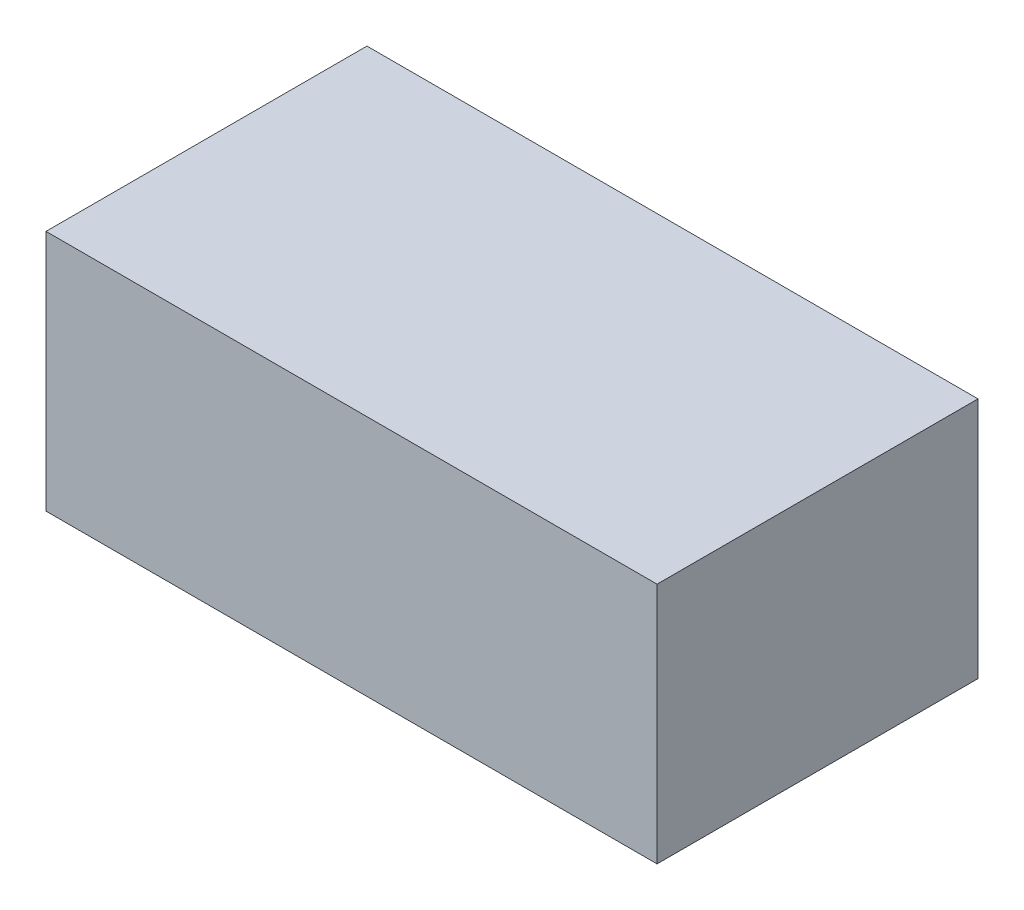
ISO-10303-21;
HEADER;
FILE_DESCRIPTION(('STEP AP214'),'2;1');
FILE_NAME('part.step','',(''),(''),'','','');
FILE_SCHEMA(('AUTOMOTIVE_DESIGN { 1 0 10303 214 1 1 1 1 }'));
ENDSEC;
DATA;
#1=APPLICATION_CONTEXT('core data for automotive mechanical design processes');
#2=APPLICATION_PROTOCOL_DEFINITION('international standard','automotive_design',2000,#1);
#3=PRODUCT_CONTEXT('',#1,'mechanical');
#4=PRODUCT('Part','Part','',(#3));
#5=PRODUCT_RELATED_PRODUCT_CATEGORY('part','',(#4));
#6=PRODUCT_DEFINITION_FORMATION('','',#4);
#7=PRODUCT_DEFINITION_CONTEXT('part definition',#1,'design');
#8=PRODUCT_DEFINITION('design','',#6,#7);
#9=PRODUCT_DEFINITION_SHAPE('','',#8);
#10=(LENGTH_UNIT() NAMED_UNIT(*) SI_UNIT(.MILLI.,.METRE.));
#11=(NAMED_UNIT(*) PLANE_ANGLE_UNIT() SI_UNIT($,.RADIAN.));
#12=(NAMED_UNIT(*) SI_UNIT($,.STERADIAN.) SOLID_ANGLE_UNIT());
#13=UNCERTAINTY_MEASURE_WITH_UNIT(LENGTH_MEASURE(1.E-05),#10,'distance_accuracy_value','');
#14=(GEOMETRIC_REPRESENTATION_CONTEXT(3) GLOBAL_UNCERTAINTY_ASSIGNED_CONTEXT((#13)) GLOBAL_UNIT_ASSIGNED_CONTEXT((#10,
#11,#12)) REPRESENTATION_CONTEXT('',''));
#15=CARTESIAN_POINT('',(0.,0.,0.));
#16=DIRECTION('',(0.,0.,1.));
#17=DIRECTION('',(1.,0.,0.));
#18=AXIS2_PLACEMENT_3D('',#15,#16,#17);
#19=CARTESIAN_POINT('',(0.,0.315,0.));
#20=DIRECTION('',(0.,1.,0.));
#21=DIRECTION('',(1.,0.,0.));
#22=AXIS2_PLACEMENT_3D('',#19,#20,#21);
#23=PLANE('',#22);
#24=DIRECTION('',(0.,0.,1.));
#25=VECTOR('',#24,1.);
#26=CARTESIAN_POINT('',(-0.315144564039,0.315,0.573169048719));
#27=LINE('',#26,#25);
#28=CARTESIAN_POINT('',(-0.315144564039,0.315,0.573169048719));
#29=VERTEX_POINT('',#28);
#30=CARTESIAN_POINT('',(-0.315144564039,0.315,0.705640651664));
#31=VERTEX_POINT('',#30);
#32=EDGE_CURVE('E89',#29,#31,#27,.T.);
#33=ORIENTED_EDGE('',*,*,#32,.F.);
#34=DIRECTION('',(-1.,0.,0.));
#35=VECTOR('',#34,1.);
#36=CARTESIAN_POINT('',(-0.315144564039,0.315,0.573169048719));
#37=LINE('',#36,#35);
#38=CARTESIAN_POINT('',(-0.06293901227704,0.315,0.573169048719));
#39=VERTEX_POINT('',#38);
#40=EDGE_CURVE('E28',#39,#29,#37,.T.);
#41=ORIENTED_EDGE('',*,*,#40,.F.);
#42=DIRECTION('',(0.,0.,-1.));
#43=VECTOR('',#42,1.);
#44=CARTESIAN_POINT('',(-0.06293901227704,0.315,0.573169048719));
#45=LINE('',#44,#43);
#46=CARTESIAN_POINT('',(-0.06293901227704,0.315,0.705640651664));
#47=VERTEX_POINT('',#46);
#48=EDGE_CURVE('E107',#47,#39,#45,.T.);
#49=ORIENTED_EDGE('',*,*,#48,.F.);
#50=DIRECTION('',(1.,0.,0.));
#51=VECTOR('',#50,1.);
#52=CARTESIAN_POINT('',(-0.315144564039,0.315,0.705640651664));
#53=LINE('',#52,#51);
#54=EDGE_CURVE('E79',#31,#47,#53,.T.);
#55=ORIENTED_EDGE('',*,*,#54,.F.);
#56=EDGE_LOOP('',(#33,#41,#49,#55));
#57=FACE_BOUND('',#56,.T.);
#58=ADVANCED_FACE('F17',(#57),#23,.F.);
#59=CARTESIAN_POINT('',(0.,0.415,0.));
#60=DIRECTION('',(0.,1.,0.));
#61=DIRECTION('',(1.,0.,0.));
#62=AXIS2_PLACEMENT_3D('',#59,#60,#61);
#63=PLANE('',#62);
#64=DIRECTION('',(0.,0.,1.));
#65=VECTOR('',#64,1.);
#66=CARTESIAN_POINT('',(-0.315144564039,0.415,0.573169048719));
#67=LINE('',#66,#65);
#68=CARTESIAN_POINT('',(-0.315144564039,0.415,0.573169048719));
#69=VERTEX_POINT('',#68);
#70=CARTESIAN_POINT('',(-0.315144564039,0.415,0.705640651664));
#71=VERTEX_POINT('',#70);
#72=EDGE_CURVE('E70',#69,#71,#67,.T.);
#73=ORIENTED_EDGE('',*,*,#72,.T.);
#74=DIRECTION('',(1.,0.,0.));
#75=VECTOR('',#74,1.);
#76=CARTESIAN_POINT('',(-0.315144564039,0.415,0.705640651664));
#77=LINE('',#76,#75);
#78=CARTESIAN_POINT('',(-0.06293901227704,0.415,0.705640651664));
#79=VERTEX_POINT('',#78);
#80=EDGE_CURVE('E93',#71,#79,#77,.T.);
#81=ORIENTED_EDGE('',*,*,#80,.T.);
#82=DIRECTION('',(0.,0.,-1.));
#83=VECTOR('',#82,1.);
#84=CARTESIAN_POINT('',(-0.06293901227704,0.415,0.573169048719));
#85=LINE('',#84,#83);
#86=CARTESIAN_POINT('',(-0.06293901227704,0.415,0.573169048719));
#87=VERTEX_POINT('',#86);
#88=EDGE_CURVE('E72',#79,#87,#85,.T.);
#89=ORIENTED_EDGE('',*,*,#88,.T.);
#90=DIRECTION('',(-1.,0.,0.));
#91=VECTOR('',#90,1.);
#92=CARTESIAN_POINT('',(-0.315144564039,0.415,0.573169048719));
#93=LINE('',#92,#91);
#94=EDGE_CURVE('E11',#87,#69,#93,.T.);
#95=ORIENTED_EDGE('',*,*,#94,.T.);
#96=EDGE_LOOP('',(#73,#81,#89,#95));
#97=FACE_BOUND('',#96,.T.);
#98=ADVANCED_FACE('F67',(#97),#63,.T.);
#99=CARTESIAN_POINT('',(-0.315144564039,0.415,0.573169048719));
#100=DIRECTION('',(0.,0.,1.));
#101=DIRECTION('',(1.,0.,0.));
#102=AXIS2_PLACEMENT_3D('',#99,#100,#101);
#103=PLANE('',#102);
#104=ORIENTED_EDGE('',*,*,#40,.T.);
#105=DIRECTION('',(0.,-1.,0.));
#106=VECTOR('',#105,1.);
#107=CARTESIAN_POINT('',(-0.315144564039,0.415,0.573169048719));
#108=LINE('',#107,#106);
#109=EDGE_CURVE('E21',#69,#29,#108,.T.);
#110=ORIENTED_EDGE('',*,*,#109,.F.);
#111=ORIENTED_EDGE('',*,*,#94,.F.);
#112=DIRECTION('',(0.,-1.,0.));
#113=VECTOR('',#112,1.);
#114=CARTESIAN_POINT('',(-0.06293901227704,0.415,0.573169048719));
#115=LINE('',#114,#113);
#116=EDGE_CURVE('E96',#87,#39,#115,.T.);
#117=ORIENTED_EDGE('',*,*,#116,.T.);
#118=EDGE_LOOP('',(#104,#110,#111,#117));
#119=FACE_BOUND('',#118,.T.);
#120=ADVANCED_FACE('F19',(#119),#103,.F.);
#121=CARTESIAN_POINT('',(-0.06293901227704,0.415,0.573169048719));
#122=DIRECTION('',(-1.,0.,0.));
#123=DIRECTION('',(0.,0.,1.));
#124=AXIS2_PLACEMENT_3D('',#121,#122,#123);
#125=PLANE('',#124);
#126=ORIENTED_EDGE('',*,*,#48,.T.);
#127=ORIENTED_EDGE('',*,*,#116,.F.);
#128=ORIENTED_EDGE('',*,*,#88,.F.);
#129=DIRECTION('',(0.,-1.,0.));
#130=VECTOR('',#129,1.);
#131=CARTESIAN_POINT('',(-0.06293901227704,0.415,0.705640651664));
#132=LINE('',#131,#130);
#133=EDGE_CURVE('E104',#79,#47,#132,.T.);
#134=ORIENTED_EDGE('',*,*,#133,.T.);
#135=EDGE_LOOP('',(#126,#127,#128,#134));
#136=FACE_BOUND('',#135,.T.);
#137=ADVANCED_FACE('F117',(#136),#125,.F.);
#138=CARTESIAN_POINT('',(-0.315144564039,0.415,0.705640651664));
#139=DIRECTION('',(0.,0.,-1.));
#140=DIRECTION('',(0.,-1.,0.));
#141=AXIS2_PLACEMENT_3D('',#138,#139,#140);
#142=PLANE('',#141);
#143=ORIENTED_EDGE('',*,*,#54,.T.);
#144=ORIENTED_EDGE('',*,*,#133,.F.);
#145=ORIENTED_EDGE('',*,*,#80,.F.);
#146=DIRECTION('',(0.,-1.,0.));
#147=VECTOR('',#146,1.);
#148=CARTESIAN_POINT('',(-0.315144564039,0.415,0.705640651664));
#149=LINE('',#148,#147);
#150=EDGE_CURVE('E82',#71,#31,#149,.T.);
#151=ORIENTED_EDGE('',*,*,#150,.T.);
#152=EDGE_LOOP('',(#143,#144,#145,#151));
#153=FACE_BOUND('',#152,.T.);
#154=ADVANCED_FACE('F116',(#153),#142,.F.);
#155=CARTESIAN_POINT('',(-0.315144564039,0.415,0.573169048719));
#156=DIRECTION('',(1.,0.,0.));
#157=DIRECTION('',(0.,1.,0.));
#158=AXIS2_PLACEMENT_3D('',#155,#156,#157);
#159=PLANE('',#158);
#160=ORIENTED_EDGE('',*,*,#32,.T.);
#161=ORIENTED_EDGE('',*,*,#150,.F.);
#162=ORIENTED_EDGE('',*,*,#72,.F.);
#163=ORIENTED_EDGE('',*,*,#109,.T.);
#164=EDGE_LOOP('',(#160,#161,#162,#163));
#165=FACE_BOUND('',#164,.T.);
#166=ADVANCED_FACE('F80',(#165),#159,.F.);
#167=CLOSED_SHELL('',(#58,#98,#120,#137,#154,#166));
#168=MANIFOLD_SOLID_BREP('B1',#167);
#169=ADVANCED_BREP_SHAPE_REPRESENTATION('',(#18,#168),#14);
#170=SHAPE_DEFINITION_REPRESENTATION(#9,#169);
ENDSEC;
END-ISO-10303-21;
